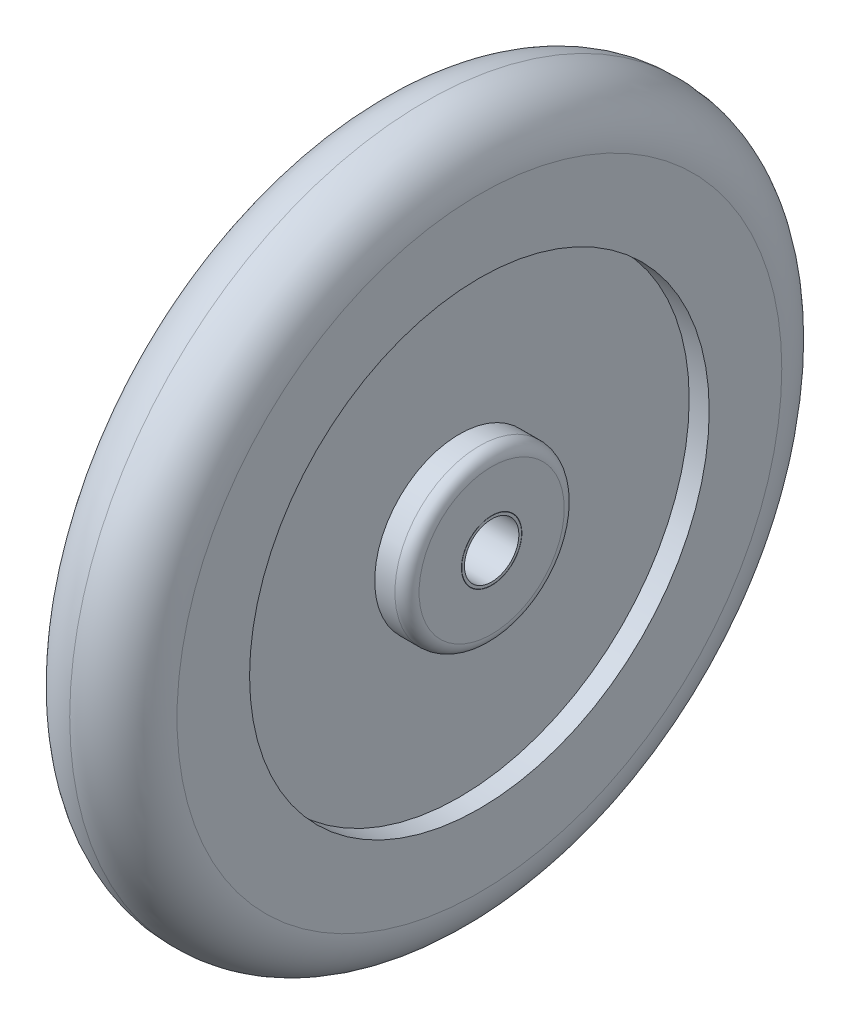
ISO-10303-21;
HEADER;
FILE_DESCRIPTION(('STEP AP214'),'2;1');
FILE_NAME('part.step','',(''),(''),'','','');
FILE_SCHEMA(('AUTOMOTIVE_DESIGN { 1 0 10303 214 1 1 1 1 }'));
ENDSEC;
DATA;
#1=APPLICATION_CONTEXT('core data for automotive mechanical design processes');
#2=APPLICATION_PROTOCOL_DEFINITION('international standard','automotive_design',2000,#1);
#3=PRODUCT_CONTEXT('',#1,'mechanical');
#4=PRODUCT('Part','Part','',(#3));
#5=PRODUCT_RELATED_PRODUCT_CATEGORY('part','',(#4));
#6=PRODUCT_DEFINITION_FORMATION('','',#4);
#7=PRODUCT_DEFINITION_CONTEXT('part definition',#1,'design');
#8=PRODUCT_DEFINITION('design','',#6,#7);
#9=PRODUCT_DEFINITION_SHAPE('','',#8);
#10=(LENGTH_UNIT() NAMED_UNIT(*) SI_UNIT(.MILLI.,.METRE.));
#11=(NAMED_UNIT(*) PLANE_ANGLE_UNIT() SI_UNIT($,.RADIAN.));
#12=(NAMED_UNIT(*) SI_UNIT($,.STERADIAN.) SOLID_ANGLE_UNIT());
#13=UNCERTAINTY_MEASURE_WITH_UNIT(LENGTH_MEASURE(1.E-05),#10,'distance_accuracy_value','');
#14=(GEOMETRIC_REPRESENTATION_CONTEXT(3) GLOBAL_UNCERTAINTY_ASSIGNED_CONTEXT((#13)) GLOBAL_UNIT_ASSIGNED_CONTEXT((#10,
#11,#12)) REPRESENTATION_CONTEXT('',''));
#15=CARTESIAN_POINT('',(0.,0.,0.));
#16=DIRECTION('',(0.,0.,1.));
#17=DIRECTION('',(1.,0.,0.));
#18=AXIS2_PLACEMENT_3D('',#15,#16,#17);
#19=CARTESIAN_POINT('',(-9.02730799055195,0.,0.));
#20=DIRECTION('',(1.,0.,0.));
#21=DIRECTION('',(0.,0.,-1.));
#22=AXIS2_PLACEMENT_3D('',#19,#20,#21);
#23=TOROIDAL_SURFACE('',#22,12.,2.);
#24=CARTESIAN_POINT('',(-9.02730799055195,0.,0.));
#25=DIRECTION('',(1.,0.,0.));
#26=DIRECTION('',(0.,0.,-1.));
#27=AXIS2_PLACEMENT_3D('',#24,#25,#26);
#28=CIRCLE('',#27,14.);
#29=CARTESIAN_POINT('',(-9.02730799055195,0.,-14.));
#30=VERTEX_POINT('',#29);
#31=EDGE_CURVE('E80',#30,#30,#28,.T.);
#32=ORIENTED_EDGE('',*,*,#31,.F.);
#33=EDGE_LOOP('',(#32));
#34=FACE_BOUND('',#33,.T.);
#35=CARTESIAN_POINT('',(-11.027307990552,0.,0.));
#36=DIRECTION('',(1.,0.,0.));
#37=DIRECTION('',(0.,0.,-1.));
#38=AXIS2_PLACEMENT_3D('',#35,#36,#37);
#39=CIRCLE('',#38,12.);
#40=CARTESIAN_POINT('',(-11.027307990552,0.,-12.));
#41=VERTEX_POINT('',#40);
#42=EDGE_CURVE('E77',#41,#41,#39,.T.);
#43=ORIENTED_EDGE('',*,*,#42,.T.);
#44=EDGE_LOOP('',(#43));
#45=FACE_BOUND('',#44,.T.);
#46=ADVANCED_FACE('F52',(#34,#45),#23,.T.);
#47=CARTESIAN_POINT('',(-11.027307990552,0.,0.));
#48=DIRECTION('',(1.,0.,0.));
#49=DIRECTION('',(0.,0.,-1.));
#50=AXIS2_PLACEMENT_3D('',#47,#48,#49);
#51=PLANE('',#50);
#52=CARTESIAN_POINT('',(-11.027307990552,0.,0.));
#53=DIRECTION('',(1.,0.,0.));
#54=DIRECTION('',(0.,0.,-1.));
#55=AXIS2_PLACEMENT_3D('',#52,#53,#54);
#56=CIRCLE('',#55,5.);
#57=CARTESIAN_POINT('',(-11.027307990552,0.,-5.));
#58=VERTEX_POINT('',#57);
#59=EDGE_CURVE('E73',#58,#58,#56,.T.);
#60=ORIENTED_EDGE('',*,*,#59,.T.);
#61=EDGE_LOOP('',(#60));
#62=FACE_BOUND('',#61,.T.);
#63=ORIENTED_EDGE('',*,*,#42,.F.);
#64=EDGE_LOOP('',(#63));
#65=FACE_BOUND('',#64,.T.);
#66=ADVANCED_FACE('F113',(#62,#65),#51,.F.);
#67=CARTESIAN_POINT('',(11.027307990552,0.,0.));
#68=DIRECTION('',(1.,0.,0.));
#69=DIRECTION('',(0.,0.,-1.));
#70=AXIS2_PLACEMENT_3D('',#67,#68,#69);
#71=PLANE('',#70);
#72=CARTESIAN_POINT('',(11.027307990552,0.,0.));
#73=DIRECTION('',(1.,0.,0.));
#74=DIRECTION('',(0.,0.,-1.));
#75=AXIS2_PLACEMENT_3D('',#72,#73,#74);
#76=CIRCLE('',#75,5.);
#77=CARTESIAN_POINT('',(11.027307990552,0.,-5.));
#78=VERTEX_POINT('',#77);
#79=EDGE_CURVE('E72',#78,#78,#76,.T.);
#80=ORIENTED_EDGE('',*,*,#79,.F.);
#81=EDGE_LOOP('',(#80));
#82=FACE_BOUND('',#81,.T.);
#83=CARTESIAN_POINT('',(11.027307990552,0.,0.));
#84=DIRECTION('',(1.,0.,0.));
#85=DIRECTION('',(0.,0.,-1.));
#86=AXIS2_PLACEMENT_3D('',#83,#84,#85);
#87=CIRCLE('',#86,12.);
#88=CARTESIAN_POINT('',(11.027307990552,0.,-12.));
#89=VERTEX_POINT('',#88);
#90=EDGE_CURVE('E76',#89,#89,#87,.T.);
#91=ORIENTED_EDGE('',*,*,#90,.T.);
#92=EDGE_LOOP('',(#91));
#93=FACE_BOUND('',#92,.T.);
#94=ADVANCED_FACE('F115',(#82,#93),#71,.T.);
#95=CARTESIAN_POINT('',(9.02730799055195,0.,0.));
#96=DIRECTION('',(1.,0.,0.));
#97=DIRECTION('',(0.,0.,-1.));
#98=AXIS2_PLACEMENT_3D('',#95,#96,#97);
#99=TOROIDAL_SURFACE('',#98,12.,2.);
#100=CARTESIAN_POINT('',(9.02730799055195,0.,0.));
#101=DIRECTION('',(1.,0.,0.));
#102=DIRECTION('',(0.,0.,-1.));
#103=AXIS2_PLACEMENT_3D('',#100,#101,#102);
#104=CIRCLE('',#103,14.);
#105=CARTESIAN_POINT('',(9.02730799055195,0.,-14.));
#106=VERTEX_POINT('',#105);
#107=EDGE_CURVE('E104',#106,#106,#104,.T.);
#108=ORIENTED_EDGE('',*,*,#107,.T.);
#109=EDGE_LOOP('',(#108));
#110=FACE_BOUND('',#109,.T.);
#111=ORIENTED_EDGE('',*,*,#90,.F.);
#112=EDGE_LOOP('',(#111));
#113=FACE_BOUND('',#112,.T.);
#114=ADVANCED_FACE('F122',(#110,#113),#99,.T.);
#115=CARTESIAN_POINT('',(0.,0.,0.));
#116=DIRECTION('',(1.,0.,0.));
#117=DIRECTION('',(0.,0.,-1.));
#118=AXIS2_PLACEMENT_3D('',#115,#116,#117);
#119=CYLINDRICAL_SURFACE('',#118,14.);
#120=CARTESIAN_POINT('',(5.69235093214229,0.,0.));
#121=DIRECTION('',(1.,0.,0.));
#122=DIRECTION('',(0.,0.,-1.));
#123=AXIS2_PLACEMENT_3D('',#120,#121,#122);
#124=CIRCLE('',#123,14.);
#125=CARTESIAN_POINT('',(5.69235093214229,0.,-14.));
#126=VERTEX_POINT('',#125);
#127=EDGE_CURVE('E101',#126,#126,#124,.T.);
#128=ORIENTED_EDGE('',*,*,#127,.T.);
#129=EDGE_LOOP('',(#128));
#130=FACE_BOUND('',#129,.T.);
#131=ORIENTED_EDGE('',*,*,#107,.F.);
#132=EDGE_LOOP('',(#131));
#133=FACE_BOUND('',#132,.T.);
#134=ADVANCED_FACE('F266',(#130,#133),#119,.T.);
#135=CARTESIAN_POINT('',(5.69235093214229,0.,0.));
#136=DIRECTION('',(1.,0.,0.));
#137=DIRECTION('',(0.,0.,-1.));
#138=AXIS2_PLACEMENT_3D('',#135,#136,#137);
#139=PLANE('',#138);
#140=CARTESIAN_POINT('',(5.69235093214229,0.,0.));
#141=DIRECTION('',(1.,0.,0.));
#142=DIRECTION('',(0.,0.,-1.));
#143=AXIS2_PLACEMENT_3D('',#140,#141,#142);
#144=CIRCLE('',#143,38.);
#145=CARTESIAN_POINT('',(5.69235093214229,0.,-38.));
#146=VERTEX_POINT('',#145);
#147=EDGE_CURVE('E98',#146,#146,#144,.T.);
#148=ORIENTED_EDGE('',*,*,#147,.T.);
#149=EDGE_LOOP('',(#148));
#150=FACE_BOUND('',#149,.T.);
#151=ORIENTED_EDGE('',*,*,#127,.F.);
#152=EDGE_LOOP('',(#151));
#153=FACE_BOUND('',#152,.T.);
#154=ADVANCED_FACE('F222',(#150,#153),#139,.T.);
#155=CARTESIAN_POINT('',(0.,0.,0.));
#156=DIRECTION('',(1.,0.,0.));
#157=DIRECTION('',(0.,0.,-1.));
#158=AXIS2_PLACEMENT_3D('',#155,#156,#157);
#159=CYLINDRICAL_SURFACE('',#158,38.);
#160=CARTESIAN_POINT('',(9.,0.,0.));
#161=DIRECTION('',(1.,0.,0.));
#162=DIRECTION('',(0.,0.,-1.));
#163=AXIS2_PLACEMENT_3D('',#160,#161,#162);
#164=CIRCLE('',#163,38.);
#165=CARTESIAN_POINT('',(9.,0.,-38.));
#166=VERTEX_POINT('',#165);
#167=EDGE_CURVE('E95',#166,#166,#164,.T.);
#168=ORIENTED_EDGE('',*,*,#167,.T.);
#169=EDGE_LOOP('',(#168));
#170=FACE_BOUND('',#169,.T.);
#171=ORIENTED_EDGE('',*,*,#147,.F.);
#172=EDGE_LOOP('',(#171));
#173=FACE_BOUND('',#172,.T.);
#174=ADVANCED_FACE('F216',(#170,#173),#159,.F.);
#175=CARTESIAN_POINT('',(9.,0.,0.));
#176=DIRECTION('',(1.,0.,0.));
#177=DIRECTION('',(0.,0.,-1.));
#178=AXIS2_PLACEMENT_3D('',#175,#176,#177);
#179=PLANE('',#178);
#180=CARTESIAN_POINT('',(9.,0.,0.));
#181=DIRECTION('',(1.,0.,0.));
#182=DIRECTION('',(0.,0.,-1.));
#183=AXIS2_PLACEMENT_3D('',#180,#181,#182);
#184=CIRCLE('',#183,50.);
#185=CARTESIAN_POINT('',(9.,0.,-50.));
#186=VERTEX_POINT('',#185);
#187=EDGE_CURVE('E92',#186,#186,#184,.T.);
#188=ORIENTED_EDGE('',*,*,#187,.T.);
#189=EDGE_LOOP('',(#188));
#190=FACE_BOUND('',#189,.T.);
#191=ORIENTED_EDGE('',*,*,#167,.F.);
#192=EDGE_LOOP('',(#191));
#193=FACE_BOUND('',#192,.T.);
#194=ADVANCED_FACE('F221',(#190,#193),#179,.T.);
#195=CARTESIAN_POINT('',(0.257609490895422,0.,0.));
#196=DIRECTION('',(1.,0.,0.));
#197=DIRECTION('',(0.,0.,-1.));
#198=AXIS2_PLACEMENT_3D('',#195,#196,#197);
#199=TOROIDAL_SURFACE('',#198,50.,8.74239050910457);
#200=CARTESIAN_POINT('',(0.,0.,0.));
#201=DIRECTION('',(1.,0.,0.));
#202=DIRECTION('',(0.,0.,-1.));
#203=AXIS2_PLACEMENT_3D('',#200,#201,#202);
#204=CIRCLE('',#203,58.738594232706);
#205=CARTESIAN_POINT('',(0.,0.,-58.738594232706));
#206=VERTEX_POINT('',#205);
#207=EDGE_CURVE('E89',#206,#206,#204,.T.);
#208=ORIENTED_EDGE('',*,*,#207,.T.);
#209=EDGE_LOOP('',(#208));
#210=FACE_BOUND('',#209,.T.);
#211=ORIENTED_EDGE('',*,*,#187,.F.);
#212=EDGE_LOOP('',(#211));
#213=FACE_BOUND('',#212,.T.);
#214=ADVANCED_FACE('F234',(#210,#213),#199,.T.);
#215=CARTESIAN_POINT('',(-0.257609490895422,0.,0.));
#216=DIRECTION('',(1.,0.,0.));
#217=DIRECTION('',(0.,0.,-1.));
#218=AXIS2_PLACEMENT_3D('',#215,#216,#217);
#219=TOROIDAL_SURFACE('',#218,50.,8.74239050910457);
#220=ORIENTED_EDGE('',*,*,#207,.F.);
#221=EDGE_LOOP('',(#220));
#222=FACE_BOUND('',#221,.T.);
#223=CARTESIAN_POINT('',(-9.,0.,0.));
#224=DIRECTION('',(1.,0.,0.));
#225=DIRECTION('',(0.,0.,-1.));
#226=AXIS2_PLACEMENT_3D('',#223,#224,#225);
#227=CIRCLE('',#226,50.);
#228=CARTESIAN_POINT('',(-9.,0.,-50.));
#229=VERTEX_POINT('',#228);
#230=EDGE_CURVE('E86',#229,#229,#227,.T.);
#231=ORIENTED_EDGE('',*,*,#230,.T.);
#232=EDGE_LOOP('',(#231));
#233=FACE_BOUND('',#232,.T.);
#234=ADVANCED_FACE('F154',(#222,#233),#219,.T.);
#235=CARTESIAN_POINT('',(-9.,0.,0.));
#236=DIRECTION('',(1.,0.,0.));
#237=DIRECTION('',(0.,0.,-1.));
#238=AXIS2_PLACEMENT_3D('',#235,#236,#237);
#239=PLANE('',#238);
#240=CARTESIAN_POINT('',(-9.,0.,0.));
#241=DIRECTION('',(1.,0.,0.));
#242=DIRECTION('',(0.,0.,-1.));
#243=AXIS2_PLACEMENT_3D('',#240,#241,#242);
#244=CIRCLE('',#243,38.2);
#245=CARTESIAN_POINT('',(-9.,0.,-38.2));
#246=VERTEX_POINT('',#245);
#247=EDGE_CURVE('E59',#246,#246,#244,.T.);
#248=ORIENTED_EDGE('',*,*,#247,.T.);
#249=EDGE_LOOP('',(#248));
#250=FACE_BOUND('',#249,.T.);
#251=ORIENTED_EDGE('',*,*,#230,.F.);
#252=EDGE_LOOP('',(#251));
#253=FACE_BOUND('',#252,.T.);
#254=ADVANCED_FACE('F146',(#250,#253),#239,.F.);
#255=CARTESIAN_POINT('',(0.,0.,0.));
#256=DIRECTION('',(1.,0.,0.));
#257=DIRECTION('',(0.,0.,-1.));
#258=AXIS2_PLACEMENT_3D('',#255,#256,#257);
#259=CYLINDRICAL_SURFACE('',#258,38.);
#260=CARTESIAN_POINT('',(-8.8,0.,0.));
#261=DIRECTION('',(1.,0.,0.));
#262=DIRECTION('',(0.,0.,-1.));
#263=AXIS2_PLACEMENT_3D('',#260,#261,#262);
#264=CIRCLE('',#263,38.);
#265=CARTESIAN_POINT('',(-8.8,0.,-38.));
#266=VERTEX_POINT('',#265);
#267=EDGE_CURVE('E12',#266,#266,#264,.F.);
#268=ORIENTED_EDGE('',*,*,#267,.T.);
#269=EDGE_LOOP('',(#268));
#270=FACE_BOUND('',#269,.T.);
#271=CARTESIAN_POINT('',(-6.69235093214229,0.,0.));
#272=DIRECTION('',(1.,0.,0.));
#273=DIRECTION('',(0.,0.,-1.));
#274=AXIS2_PLACEMENT_3D('',#271,#272,#273);
#275=CIRCLE('',#274,38.);
#276=CARTESIAN_POINT('',(-6.69235093214229,0.,-38.));
#277=VERTEX_POINT('',#276);
#278=EDGE_CURVE('E67',#277,#277,#275,.T.);
#279=ORIENTED_EDGE('',*,*,#278,.T.);
#280=EDGE_LOOP('',(#279));
#281=FACE_BOUND('',#280,.T.);
#282=ADVANCED_FACE('F143',(#270,#281),#259,.F.);
#283=CARTESIAN_POINT('',(-5.69235093214229,0.,0.));
#284=DIRECTION('',(1.,0.,0.));
#285=DIRECTION('',(0.,0.,-1.));
#286=AXIS2_PLACEMENT_3D('',#283,#284,#285);
#287=PLANE('',#286);
#288=CARTESIAN_POINT('',(-5.69235093214229,0.,0.));
#289=DIRECTION('',(1.,0.,0.));
#290=DIRECTION('',(0.,0.,-1.));
#291=AXIS2_PLACEMENT_3D('',#288,#289,#290);
#292=CIRCLE('',#291,37.);
#293=CARTESIAN_POINT('',(-5.69235093214229,0.,-37.));
#294=VERTEX_POINT('',#293);
#295=EDGE_CURVE('E63',#294,#294,#292,.F.);
#296=ORIENTED_EDGE('',*,*,#295,.T.);
#297=EDGE_LOOP('',(#296));
#298=FACE_BOUND('',#297,.T.);
#299=CARTESIAN_POINT('',(-5.69235093214229,0.,0.));
#300=DIRECTION('',(1.,0.,0.));
#301=DIRECTION('',(0.,0.,-1.));
#302=AXIS2_PLACEMENT_3D('',#299,#300,#301);
#303=CIRCLE('',#302,14.);
#304=CARTESIAN_POINT('',(-5.69235093214229,0.,-14.));
#305=VERTEX_POINT('',#304);
#306=EDGE_CURVE('E83',#305,#305,#303,.T.);
#307=ORIENTED_EDGE('',*,*,#306,.T.);
#308=EDGE_LOOP('',(#307));
#309=FACE_BOUND('',#308,.T.);
#310=ADVANCED_FACE('F145',(#298,#309),#287,.F.);
#311=CARTESIAN_POINT('',(0.,0.,0.));
#312=DIRECTION('',(1.,0.,0.));
#313=DIRECTION('',(0.,0.,-1.));
#314=AXIS2_PLACEMENT_3D('',#311,#312,#313);
#315=CYLINDRICAL_SURFACE('',#314,14.);
#316=ORIENTED_EDGE('',*,*,#306,.F.);
#317=EDGE_LOOP('',(#316));
#318=FACE_BOUND('',#317,.T.);
#319=ORIENTED_EDGE('',*,*,#31,.T.);
#320=EDGE_LOOP('',(#319));
#321=FACE_BOUND('',#320,.T.);
#322=ADVANCED_FACE('F137',(#318,#321),#315,.T.);
#323=CARTESIAN_POINT('',(-11.027307990552,0.,0.));
#324=DIRECTION('',(1.,0.,0.));
#325=DIRECTION('',(0.,0.,-1.));
#326=AXIS2_PLACEMENT_3D('',#323,#324,#325);
#327=CYLINDRICAL_SURFACE('',#326,5.);
#328=ORIENTED_EDGE('',*,*,#59,.F.);
#329=EDGE_LOOP('',(#328));
#330=FACE_BOUND('',#329,.T.);
#331=ORIENTED_EDGE('',*,*,#79,.T.);
#332=EDGE_LOOP('',(#331));
#333=FACE_BOUND('',#332,.T.);
#334=ADVANCED_FACE('F130',(#330,#333),#327,.F.);
#335=CARTESIAN_POINT('',(-6.69235093214229,0.,0.));
#336=DIRECTION('',(1.,0.,0.));
#337=DIRECTION('',(0.,0.,-1.));
#338=AXIS2_PLACEMENT_3D('',#335,#336,#337);
#339=TOROIDAL_SURFACE('',#338,37.,1.);
#340=ORIENTED_EDGE('',*,*,#295,.F.);
#341=EDGE_LOOP('',(#340));
#342=FACE_BOUND('',#341,.T.);
#343=ORIENTED_EDGE('',*,*,#278,.F.);
#344=EDGE_LOOP('',(#343));
#345=FACE_BOUND('',#344,.T.);
#346=ADVANCED_FACE('F128',(#342,#345),#339,.F.);
#347=CARTESIAN_POINT('',(-8.8,0.,0.));
#348=DIRECTION('',(1.,0.,0.));
#349=DIRECTION('',(0.,0.,-1.));
#350=AXIS2_PLACEMENT_3D('',#347,#348,#349);
#351=TOROIDAL_SURFACE('',#350,38.2,0.2);
#352=ORIENTED_EDGE('',*,*,#267,.F.);
#353=EDGE_LOOP('',(#352));
#354=FACE_BOUND('',#353,.T.);
#355=ORIENTED_EDGE('',*,*,#247,.F.);
#356=EDGE_LOOP('',(#355));
#357=FACE_BOUND('',#356,.T.);
#358=ADVANCED_FACE('F54',(#354,#357),#351,.T.);
#359=CLOSED_SHELL('',(#46,#66,#94,#114,#134,#154,#174,#194,#214,#234,#254,#282,#310,#322,#334,
#346,#358));
#360=MANIFOLD_SOLID_BREP('B2',#359);
#361=CARTESIAN_POINT('',(11.027307990552,0.,0.));
#362=DIRECTION('',(1.,0.,0.));
#363=DIRECTION('',(0.,0.,-1.));
#364=AXIS2_PLACEMENT_3D('',#361,#362,#363);
#365=PLANE('',#364);
#366=CARTESIAN_POINT('',(11.027307990552,0.,0.));
#367=DIRECTION('',(1.,0.,0.));
#368=DIRECTION('',(0.,0.,-1.));
#369=AXIS2_PLACEMENT_3D('',#366,#367,#368);
#370=CIRCLE('',#369,4.5);
#371=CARTESIAN_POINT('',(11.027307990552,0.,-4.5));
#372=VERTEX_POINT('',#371);
#373=EDGE_CURVE('E348',#372,#372,#370,.T.);
#374=ORIENTED_EDGE('',*,*,#373,.F.);
#375=EDGE_LOOP('',(#374));
#376=FACE_BOUND('',#375,.T.);
#377=CARTESIAN_POINT('',(11.027307990552,0.,0.));
#378=DIRECTION('',(1.,0.,0.));
#379=DIRECTION('',(0.,0.,-1.));
#380=AXIS2_PLACEMENT_3D('',#377,#378,#379);
#381=CIRCLE('',#380,4.95);
#382=CARTESIAN_POINT('',(11.027307990552,0.,-4.95));
#383=VERTEX_POINT('',#382);
#384=EDGE_CURVE('E357',#383,#383,#381,.T.);
#385=ORIENTED_EDGE('',*,*,#384,.T.);
#386=EDGE_LOOP('',(#385));
#387=FACE_BOUND('',#386,.T.);
#388=ADVANCED_FACE('F344',(#376,#387),#365,.T.);
#389=CARTESIAN_POINT('',(-11.027307990552,0.,0.));
#390=DIRECTION('',(1.,0.,0.));
#391=DIRECTION('',(0.,0.,-1.));
#392=AXIS2_PLACEMENT_3D('',#389,#390,#391);
#393=CYLINDRICAL_SURFACE('',#392,4.5);
#394=CARTESIAN_POINT('',(-11.027307990552,0.,0.));
#395=DIRECTION('',(1.,0.,0.));
#396=DIRECTION('',(0.,0.,-1.));
#397=AXIS2_PLACEMENT_3D('',#394,#395,#396);
#398=CIRCLE('',#397,4.5);
#399=CARTESIAN_POINT('',(-11.027307990552,0.,-4.5));
#400=VERTEX_POINT('',#399);
#401=EDGE_CURVE('E51',#400,#400,#398,.T.);
#402=ORIENTED_EDGE('',*,*,#401,.F.);
#403=EDGE_LOOP('',(#402));
#404=FACE_BOUND('',#403,.T.);
#405=ORIENTED_EDGE('',*,*,#373,.T.);
#406=EDGE_LOOP('',(#405));
#407=FACE_BOUND('',#406,.T.);
#408=ADVANCED_FACE('F370',(#404,#407),#393,.F.);
#409=CARTESIAN_POINT('',(-11.027307990552,0.,0.));
#410=DIRECTION('',(1.,0.,0.));
#411=DIRECTION('',(0.,0.,-1.));
#412=AXIS2_PLACEMENT_3D('',#409,#410,#411);
#413=CYLINDRICAL_SURFACE('',#412,4.95);
#414=CARTESIAN_POINT('',(-11.027307990552,0.,0.));
#415=DIRECTION('',(1.,0.,0.));
#416=DIRECTION('',(0.,0.,-1.));
#417=AXIS2_PLACEMENT_3D('',#414,#415,#416);
#418=CIRCLE('',#417,4.95);
#419=CARTESIAN_POINT('',(-11.027307990552,0.,-4.95));
#420=VERTEX_POINT('',#419);
#421=EDGE_CURVE('E355',#420,#420,#418,.T.);
#422=ORIENTED_EDGE('',*,*,#421,.T.);
#423=EDGE_LOOP('',(#422));
#424=FACE_BOUND('',#423,.T.);
#425=ORIENTED_EDGE('',*,*,#384,.F.);
#426=EDGE_LOOP('',(#425));
#427=FACE_BOUND('',#426,.T.);
#428=ADVANCED_FACE('F363',(#424,#427),#413,.T.);
#429=CARTESIAN_POINT('',(-11.027307990552,0.,0.));
#430=DIRECTION('',(1.,0.,0.));
#431=DIRECTION('',(0.,0.,-1.));
#432=AXIS2_PLACEMENT_3D('',#429,#430,#431);
#433=PLANE('',#432);
#434=ORIENTED_EDGE('',*,*,#401,.T.);
#435=EDGE_LOOP('',(#434));
#436=FACE_BOUND('',#435,.T.);
#437=ORIENTED_EDGE('',*,*,#421,.F.);
#438=EDGE_LOOP('',(#437));
#439=FACE_BOUND('',#438,.T.);
#440=ADVANCED_FACE('F346',(#436,#439),#433,.F.);
#441=CLOSED_SHELL('',(#388,#408,#428,#440));
#442=MANIFOLD_SOLID_BREP('B7',#441);
#443=ADVANCED_BREP_SHAPE_REPRESENTATION('',(#18,#360,#442),#14);
#444=SHAPE_DEFINITION_REPRESENTATION(#9,#443);
ENDSEC;
END-ISO-10303-21;
